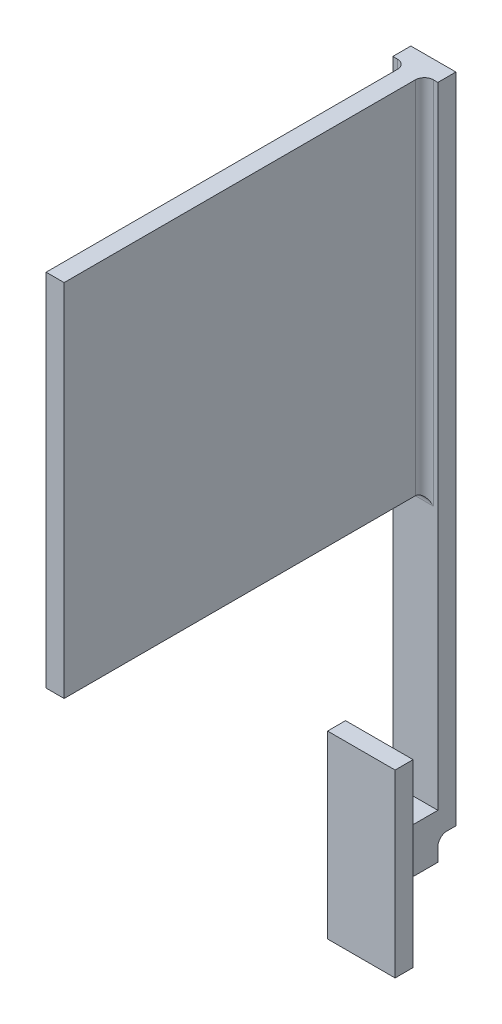
ISO-10303-21;
HEADER;
FILE_DESCRIPTION(('STEP AP214'),'2;1');
FILE_NAME('part.step','',(''),(''),'','','');
FILE_SCHEMA(('AUTOMOTIVE_DESIGN { 1 0 10303 214 1 1 1 1 }'));
ENDSEC;
DATA;
#1=APPLICATION_CONTEXT('core data for automotive mechanical design processes');
#2=APPLICATION_PROTOCOL_DEFINITION('international standard','automotive_design',2000,#1);
#3=PRODUCT_CONTEXT('',#1,'mechanical');
#4=PRODUCT('Part','Part','',(#3));
#5=PRODUCT_RELATED_PRODUCT_CATEGORY('part','',(#4));
#6=PRODUCT_DEFINITION_FORMATION('','',#4);
#7=PRODUCT_DEFINITION_CONTEXT('part definition',#1,'design');
#8=PRODUCT_DEFINITION('design','',#6,#7);
#9=PRODUCT_DEFINITION_SHAPE('','',#8);
#10=(LENGTH_UNIT() NAMED_UNIT(*) SI_UNIT(.MILLI.,.METRE.));
#11=(NAMED_UNIT(*) PLANE_ANGLE_UNIT() SI_UNIT($,.RADIAN.));
#12=(NAMED_UNIT(*) SI_UNIT($,.STERADIAN.) SOLID_ANGLE_UNIT());
#13=UNCERTAINTY_MEASURE_WITH_UNIT(LENGTH_MEASURE(1.E-05),#10,'distance_accuracy_value','');
#14=(GEOMETRIC_REPRESENTATION_CONTEXT(3) GLOBAL_UNCERTAINTY_ASSIGNED_CONTEXT((#13)) GLOBAL_UNIT_ASSIGNED_CONTEXT((#10,
#11,#12)) REPRESENTATION_CONTEXT('',''));
#15=CARTESIAN_POINT('',(0.,0.,0.));
#16=DIRECTION('',(0.,0.,1.));
#17=DIRECTION('',(1.,0.,0.));
#18=AXIS2_PLACEMENT_3D('',#15,#16,#17);
#19=CARTESIAN_POINT('',(0.,0.,-4.));
#20=DIRECTION('',(0.,0.,1.));
#21=DIRECTION('',(1.,0.,0.));
#22=AXIS2_PLACEMENT_3D('',#19,#20,#21);
#23=PLANE('',#22);
#24=DIRECTION('',(1.,0.,0.));
#25=VECTOR('',#24,1.);
#26=CARTESIAN_POINT('',(0.,31.5,-4.));
#27=LINE('',#26,#25);
#28=CARTESIAN_POINT('',(1.99999999999999,31.5,-4.));
#29=VERTEX_POINT('',#28);
#30=CARTESIAN_POINT('',(-1.99999999999999,31.5,-4.));
#31=VERTEX_POINT('',#30);
#32=EDGE_CURVE('E304',#29,#31,#27,.F.);
#33=ORIENTED_EDGE('',*,*,#32,.T.);
#34=DIRECTION('',(0.,-1.,0.));
#35=VECTOR('',#34,1.);
#36=CARTESIAN_POINT('',(-1.99999999999999,0.,-4.));
#37=LINE('',#36,#35);
#38=CARTESIAN_POINT('',(-2.,72.5,-4.));
#39=VERTEX_POINT('',#38);
#40=EDGE_CURVE('E307',#31,#39,#37,.F.);
#41=ORIENTED_EDGE('',*,*,#40,.T.);
#42=DIRECTION('',(1.,0.,0.));
#43=VECTOR('',#42,1.);
#44=CARTESIAN_POINT('',(2.50000000000003,72.5,-4.));
#45=LINE('',#44,#43);
#46=CARTESIAN_POINT('',(-2.5,72.5,-4.));
#47=VERTEX_POINT('',#46);
#48=EDGE_CURVE('E209',#47,#39,#45,.T.);
#49=ORIENTED_EDGE('',*,*,#48,.F.);
#50=DIRECTION('',(0.,1.,0.));
#51=VECTOR('',#50,1.);
#52=CARTESIAN_POINT('',(-2.5,0.,-4.));
#53=LINE('',#52,#51);
#54=CARTESIAN_POINT('',(-2.5,2.5,-4.));
#55=VERTEX_POINT('',#54);
#56=EDGE_CURVE('E198',#55,#47,#53,.T.);
#57=ORIENTED_EDGE('',*,*,#56,.F.);
#58=DIRECTION('',(1.,0.,0.));
#59=VECTOR('',#58,1.);
#60=CARTESIAN_POINT('',(-2.5,2.5,-4.));
#61=LINE('',#60,#59);
#62=CARTESIAN_POINT('',(2.5,2.5,-4.));
#63=VERTEX_POINT('',#62);
#64=EDGE_CURVE('E239',#55,#63,#61,.T.);
#65=ORIENTED_EDGE('',*,*,#64,.T.);
#66=DIRECTION('',(0.,-1.,0.));
#67=VECTOR('',#66,1.);
#68=CARTESIAN_POINT('',(2.5,0.,-4.));
#69=LINE('',#68,#67);
#70=CARTESIAN_POINT('',(2.50000000000003,72.5,-4.));
#71=VERTEX_POINT('',#70);
#72=EDGE_CURVE('E196',#71,#63,#69,.T.);
#73=ORIENTED_EDGE('',*,*,#72,.F.);
#74=CARTESIAN_POINT('',(2.,72.5,-4.));
#75=VERTEX_POINT('',#74);
#76=EDGE_CURVE('E217',#75,#71,#45,.T.);
#77=ORIENTED_EDGE('',*,*,#76,.F.);
#78=DIRECTION('',(0.,1.,0.));
#79=VECTOR('',#78,1.);
#80=CARTESIAN_POINT('',(1.99999999999999,0.,-4.));
#81=LINE('',#80,#79);
#82=EDGE_CURVE('E310',#75,#29,#81,.F.);
#83=ORIENTED_EDGE('',*,*,#82,.T.);
#84=EDGE_LOOP('',(#33,#41,#49,#57,#65,#73,#77,#83));
#85=FACE_BOUND('',#84,.T.);
#86=ADVANCED_FACE('F41',(#85),#23,.T.);
#87=CARTESIAN_POINT('',(3.75,-10.,2.));
#88=DIRECTION('',(-1.,0.,0.));
#89=DIRECTION('',(0.,0.,1.));
#90=AXIS2_PLACEMENT_3D('',#87,#88,#89);
#91=PLANE('',#90);
#92=DIRECTION('',(0.,1.,0.));
#93=VECTOR('',#92,1.);
#94=CARTESIAN_POINT('',(3.75,-10.,0.));
#95=LINE('',#94,#93);
#96=CARTESIAN_POINT('',(3.75,-10.,0.));
#97=VERTEX_POINT('',#96);
#98=CARTESIAN_POINT('',(3.75,10.,0.));
#99=VERTEX_POINT('',#98);
#100=EDGE_CURVE('E265',#97,#99,#95,.T.);
#101=ORIENTED_EDGE('',*,*,#100,.T.);
#102=DIRECTION('',(0.,0.,-1.));
#103=VECTOR('',#102,1.);
#104=CARTESIAN_POINT('',(3.75,10.,2.));
#105=LINE('',#104,#103);
#106=CARTESIAN_POINT('',(3.75,10.,2.));
#107=VERTEX_POINT('',#106);
#108=EDGE_CURVE('E292',#107,#99,#105,.T.);
#109=ORIENTED_EDGE('',*,*,#108,.F.);
#110=DIRECTION('',(0.,1.,0.));
#111=VECTOR('',#110,1.);
#112=CARTESIAN_POINT('',(3.75,-10.,2.));
#113=LINE('',#112,#111);
#114=CARTESIAN_POINT('',(3.75,-10.,2.));
#115=VERTEX_POINT('',#114);
#116=EDGE_CURVE('E268',#115,#107,#113,.T.);
#117=ORIENTED_EDGE('',*,*,#116,.F.);
#118=DIRECTION('',(0.,0.,-1.));
#119=VECTOR('',#118,1.);
#120=CARTESIAN_POINT('',(3.75,-10.,2.));
#121=LINE('',#120,#119);
#122=EDGE_CURVE('E277',#115,#97,#121,.T.);
#123=ORIENTED_EDGE('',*,*,#122,.T.);
#124=EDGE_LOOP('',(#101,#109,#117,#123));
#125=FACE_BOUND('',#124,.T.);
#126=ADVANCED_FACE('F352',(#125),#91,.F.);
#127=CARTESIAN_POINT('',(-3.75,10.,2.));
#128=DIRECTION('',(0.,-1.,0.));
#129=DIRECTION('',(0.,0.,-1.));
#130=AXIS2_PLACEMENT_3D('',#127,#128,#129);
#131=PLANE('',#130);
#132=DIRECTION('',(-1.,0.,0.));
#133=VECTOR('',#132,1.);
#134=CARTESIAN_POINT('',(-3.75,10.,0.));
#135=LINE('',#134,#133);
#136=CARTESIAN_POINT('',(-3.75,10.,0.));
#137=VERTEX_POINT('',#136);
#138=EDGE_CURVE('E276',#99,#137,#135,.T.);
#139=ORIENTED_EDGE('',*,*,#138,.T.);
#140=DIRECTION('',(0.,0.,-1.));
#141=VECTOR('',#140,1.);
#142=CARTESIAN_POINT('',(-3.75,10.,2.));
#143=LINE('',#142,#141);
#144=CARTESIAN_POINT('',(-3.75,10.,2.));
#145=VERTEX_POINT('',#144);
#146=EDGE_CURVE('E289',#145,#137,#143,.T.);
#147=ORIENTED_EDGE('',*,*,#146,.F.);
#148=DIRECTION('',(-1.,0.,0.));
#149=VECTOR('',#148,1.);
#150=CARTESIAN_POINT('',(-3.75,10.,2.));
#151=LINE('',#150,#149);
#152=EDGE_CURVE('E269',#107,#145,#151,.T.);
#153=ORIENTED_EDGE('',*,*,#152,.F.);
#154=ORIENTED_EDGE('',*,*,#108,.T.);
#155=EDGE_LOOP('',(#139,#147,#153,#154));
#156=FACE_BOUND('',#155,.T.);
#157=ADVANCED_FACE('F365',(#156),#131,.F.);
#158=CARTESIAN_POINT('',(-3.75,-10.,2.));
#159=DIRECTION('',(1.,0.,0.));
#160=DIRECTION('',(0.,0.,-1.));
#161=AXIS2_PLACEMENT_3D('',#158,#159,#160);
#162=PLANE('',#161);
#163=DIRECTION('',(0.,-1.,0.));
#164=VECTOR('',#163,1.);
#165=CARTESIAN_POINT('',(-3.75,-10.,0.));
#166=LINE('',#165,#164);
#167=CARTESIAN_POINT('',(-3.75,-10.,0.));
#168=VERTEX_POINT('',#167);
#169=EDGE_CURVE('E281',#137,#168,#166,.T.);
#170=ORIENTED_EDGE('',*,*,#169,.T.);
#171=DIRECTION('',(0.,0.,-1.));
#172=VECTOR('',#171,1.);
#173=CARTESIAN_POINT('',(-3.75,-10.,2.));
#174=LINE('',#173,#172);
#175=CARTESIAN_POINT('',(-3.75,-10.,2.));
#176=VERTEX_POINT('',#175);
#177=EDGE_CURVE('E288',#176,#168,#174,.T.);
#178=ORIENTED_EDGE('',*,*,#177,.F.);
#179=DIRECTION('',(0.,-1.,0.));
#180=VECTOR('',#179,1.);
#181=CARTESIAN_POINT('',(-3.75,-10.,2.));
#182=LINE('',#181,#180);
#183=EDGE_CURVE('E275',#145,#176,#182,.T.);
#184=ORIENTED_EDGE('',*,*,#183,.F.);
#185=ORIENTED_EDGE('',*,*,#146,.T.);
#186=EDGE_LOOP('',(#170,#178,#184,#185));
#187=FACE_BOUND('',#186,.T.);
#188=ADVANCED_FACE('F397',(#187),#162,.F.);
#189=CARTESIAN_POINT('',(-3.75,-10.,2.));
#190=DIRECTION('',(0.,1.,0.));
#191=DIRECTION('',(0.,0.,1.));
#192=AXIS2_PLACEMENT_3D('',#189,#190,#191);
#193=PLANE('',#192);
#194=DIRECTION('',(1.,0.,0.));
#195=VECTOR('',#194,1.);
#196=CARTESIAN_POINT('',(-3.75,-10.,0.));
#197=LINE('',#196,#195);
#198=EDGE_CURVE('E267',#168,#97,#197,.T.);
#199=ORIENTED_EDGE('',*,*,#198,.T.);
#200=ORIENTED_EDGE('',*,*,#122,.F.);
#201=DIRECTION('',(1.,0.,0.));
#202=VECTOR('',#201,1.);
#203=CARTESIAN_POINT('',(-3.75,-10.,2.));
#204=LINE('',#203,#202);
#205=EDGE_CURVE('E274',#176,#115,#204,.T.);
#206=ORIENTED_EDGE('',*,*,#205,.F.);
#207=ORIENTED_EDGE('',*,*,#177,.T.);
#208=EDGE_LOOP('',(#199,#200,#206,#207));
#209=FACE_BOUND('',#208,.T.);
#210=ADVANCED_FACE('F394',(#209),#193,.F.);
#211=CARTESIAN_POINT('',(0.,0.,2.));
#212=DIRECTION('',(0.,0.,-1.));
#213=DIRECTION('',(-1.,0.,0.));
#214=AXIS2_PLACEMENT_3D('',#211,#212,#213);
#215=PLANE('',#214);
#216=ORIENTED_EDGE('',*,*,#116,.T.);
#217=ORIENTED_EDGE('',*,*,#152,.T.);
#218=ORIENTED_EDGE('',*,*,#183,.T.);
#219=ORIENTED_EDGE('',*,*,#205,.T.);
#220=EDGE_LOOP('',(#216,#217,#218,#219));
#221=FACE_BOUND('',#220,.T.);
#222=ADVANCED_FACE('F388',(#221),#215,.F.);
#223=CARTESIAN_POINT('',(0.,0.,0.));
#224=DIRECTION('',(0.,0.,-1.));
#225=DIRECTION('',(-1.,0.,0.));
#226=AXIS2_PLACEMENT_3D('',#223,#224,#225);
#227=PLANE('',#226);
#228=DIRECTION('',(0.,-1.,0.));
#229=VECTOR('',#228,1.);
#230=CARTESIAN_POINT('',(2.5,-2.5,0.));
#231=LINE('',#230,#229);
#232=CARTESIAN_POINT('',(2.5,2.5,0.));
#233=VERTEX_POINT('',#232);
#234=CARTESIAN_POINT('',(2.5,-2.5,0.));
#235=VERTEX_POINT('',#234);
#236=EDGE_CURVE('E233',#233,#235,#231,.T.);
#237=ORIENTED_EDGE('',*,*,#236,.F.);
#238=DIRECTION('',(1.,0.,0.));
#239=VECTOR('',#238,1.);
#240=CARTESIAN_POINT('',(-2.5,2.5,0.));
#241=LINE('',#240,#239);
#242=CARTESIAN_POINT('',(-2.5,2.5,0.));
#243=VERTEX_POINT('',#242);
#244=EDGE_CURVE('E232',#243,#233,#241,.T.);
#245=ORIENTED_EDGE('',*,*,#244,.F.);
#246=DIRECTION('',(0.,1.,0.));
#247=VECTOR('',#246,1.);
#248=CARTESIAN_POINT('',(-2.5,-2.5,0.));
#249=LINE('',#248,#247);
#250=CARTESIAN_POINT('',(-2.5,-2.5,0.));
#251=VERTEX_POINT('',#250);
#252=EDGE_CURVE('E248',#251,#243,#249,.T.);
#253=ORIENTED_EDGE('',*,*,#252,.F.);
#254=DIRECTION('',(-1.,0.,0.));
#255=VECTOR('',#254,1.);
#256=CARTESIAN_POINT('',(-2.5,-2.5,0.));
#257=LINE('',#256,#255);
#258=EDGE_CURVE('E246',#235,#251,#257,.T.);
#259=ORIENTED_EDGE('',*,*,#258,.F.);
#260=EDGE_LOOP('',(#237,#245,#253,#259));
#261=FACE_BOUND('',#260,.T.);
#262=ORIENTED_EDGE('',*,*,#100,.F.);
#263=ORIENTED_EDGE('',*,*,#198,.F.);
#264=ORIENTED_EDGE('',*,*,#169,.F.);
#265=ORIENTED_EDGE('',*,*,#138,.F.);
#266=EDGE_LOOP('',(#262,#263,#264,#265));
#267=FACE_BOUND('',#266,.T.);
#268=ADVANCED_FACE('F386',(#261,#267),#227,.T.);
#269=CARTESIAN_POINT('',(2.5,-2.5,-4.));
#270=DIRECTION('',(-1.,0.,0.));
#271=DIRECTION('',(0.,0.,1.));
#272=AXIS2_PLACEMENT_3D('',#269,#270,#271);
#273=PLANE('',#272);
#274=ORIENTED_EDGE('',*,*,#236,.T.);
#275=DIRECTION('',(0.,0.,1.));
#276=VECTOR('',#275,1.);
#277=CARTESIAN_POINT('',(2.5,-2.5,-4.));
#278=LINE('',#277,#276);
#279=CARTESIAN_POINT('',(2.5,-2.5,-4.));
#280=VERTEX_POINT('',#279);
#281=EDGE_CURVE('E262',#280,#235,#278,.T.);
#282=ORIENTED_EDGE('',*,*,#281,.F.);
#283=DIRECTION('',(0.,-1.,0.));
#284=VECTOR('',#283,1.);
#285=CARTESIAN_POINT('',(2.5,-2.5,-4.));
#286=LINE('',#285,#284);
#287=CARTESIAN_POINT('',(2.5,-1.,-4.));
#288=VERTEX_POINT('',#287);
#289=EDGE_CURVE('E235',#288,#280,#286,.T.);
#290=ORIENTED_EDGE('',*,*,#289,.F.);
#291=CARTESIAN_POINT('',(2.5,-1.,-5.));
#292=DIRECTION('',(-1.,0.,0.));
#293=DIRECTION('',(0.,0.,1.));
#294=AXIS2_PLACEMENT_3D('',#291,#292,#293);
#295=CIRCLE('',#294,1.);
#296=CARTESIAN_POINT('',(2.5,0.,-5.));
#297=VERTEX_POINT('',#296);
#298=EDGE_CURVE('E305',#288,#297,#295,.T.);
#299=ORIENTED_EDGE('',*,*,#298,.T.);
#300=DIRECTION('',(0.,0.,1.));
#301=VECTOR('',#300,1.);
#302=CARTESIAN_POINT('',(2.5,0.,-6.));
#303=LINE('',#302,#301);
#304=CARTESIAN_POINT('',(2.5,0.,-6.));
#305=VERTEX_POINT('',#304);
#306=EDGE_CURVE('E226',#305,#297,#303,.T.);
#307=ORIENTED_EDGE('',*,*,#306,.F.);
#308=DIRECTION('',(0.,-1.,0.));
#309=VECTOR('',#308,1.);
#310=CARTESIAN_POINT('',(2.5,0.,-6.));
#311=LINE('',#310,#309);
#312=CARTESIAN_POINT('',(2.50000000000003,72.5,-6.));
#313=VERTEX_POINT('',#312);
#314=EDGE_CURVE('E202',#313,#305,#311,.T.);
#315=ORIENTED_EDGE('',*,*,#314,.F.);
#316=DIRECTION('',(0.,0.,1.));
#317=VECTOR('',#316,1.);
#318=CARTESIAN_POINT('',(2.50000000000003,72.5,-6.));
#319=LINE('',#318,#317);
#320=EDGE_CURVE('E211',#313,#71,#319,.T.);
#321=ORIENTED_EDGE('',*,*,#320,.T.);
#322=ORIENTED_EDGE('',*,*,#72,.T.);
#323=DIRECTION('',(0.,0.,1.));
#324=VECTOR('',#323,1.);
#325=CARTESIAN_POINT('',(2.5,2.5,-4.));
#326=LINE('',#325,#324);
#327=EDGE_CURVE('E243',#63,#233,#326,.T.);
#328=ORIENTED_EDGE('',*,*,#327,.T.);
#329=EDGE_LOOP('',(#274,#282,#290,#299,#307,#315,#321,#322,#328));
#330=FACE_BOUND('',#329,.T.);
#331=ADVANCED_FACE('F334',(#330),#273,.F.);
#332=CARTESIAN_POINT('',(-2.5,-2.5,-4.));
#333=DIRECTION('',(0.,1.,0.));
#334=DIRECTION('',(-1.,0.,0.));
#335=AXIS2_PLACEMENT_3D('',#332,#333,#334);
#336=PLANE('',#335);
#337=ORIENTED_EDGE('',*,*,#258,.T.);
#338=DIRECTION('',(0.,0.,1.));
#339=VECTOR('',#338,1.);
#340=CARTESIAN_POINT('',(-2.5,-2.5,-4.));
#341=LINE('',#340,#339);
#342=CARTESIAN_POINT('',(-2.5,-2.5,-4.));
#343=VERTEX_POINT('',#342);
#344=EDGE_CURVE('E256',#343,#251,#341,.T.);
#345=ORIENTED_EDGE('',*,*,#344,.F.);
#346=DIRECTION('',(-1.,0.,0.));
#347=VECTOR('',#346,1.);
#348=CARTESIAN_POINT('',(-2.5,-2.5,-4.));
#349=LINE('',#348,#347);
#350=EDGE_CURVE('E234',#280,#343,#349,.T.);
#351=ORIENTED_EDGE('',*,*,#350,.F.);
#352=ORIENTED_EDGE('',*,*,#281,.T.);
#353=EDGE_LOOP('',(#337,#345,#351,#352));
#354=FACE_BOUND('',#353,.T.);
#355=ADVANCED_FACE('F384',(#354),#336,.F.);
#356=CARTESIAN_POINT('',(-2.5,-2.5,-4.));
#357=DIRECTION('',(1.,0.,0.));
#358=DIRECTION('',(0.,0.,-1.));
#359=AXIS2_PLACEMENT_3D('',#356,#357,#358);
#360=PLANE('',#359);
#361=ORIENTED_EDGE('',*,*,#252,.T.);
#362=DIRECTION('',(0.,0.,1.));
#363=VECTOR('',#362,1.);
#364=CARTESIAN_POINT('',(-2.5,2.5,-4.));
#365=LINE('',#364,#363);
#366=EDGE_CURVE('E257',#55,#243,#365,.T.);
#367=ORIENTED_EDGE('',*,*,#366,.F.);
#368=ORIENTED_EDGE('',*,*,#56,.T.);
#369=DIRECTION('',(0.,0.,1.));
#370=VECTOR('',#369,1.);
#371=CARTESIAN_POINT('',(-2.5,72.5,-6.));
#372=LINE('',#371,#370);
#373=CARTESIAN_POINT('',(-2.5,72.5,-6.));
#374=VERTEX_POINT('',#373);
#375=EDGE_CURVE('E225',#374,#47,#372,.T.);
#376=ORIENTED_EDGE('',*,*,#375,.F.);
#377=DIRECTION('',(0.,1.,0.));
#378=VECTOR('',#377,1.);
#379=CARTESIAN_POINT('',(-2.5,0.,-6.));
#380=LINE('',#379,#378);
#381=CARTESIAN_POINT('',(-2.5,0.,-6.));
#382=VERTEX_POINT('',#381);
#383=EDGE_CURVE('E212',#382,#374,#380,.T.);
#384=ORIENTED_EDGE('',*,*,#383,.F.);
#385=DIRECTION('',(0.,0.,1.));
#386=VECTOR('',#385,1.);
#387=CARTESIAN_POINT('',(-2.5,0.,-6.));
#388=LINE('',#387,#386);
#389=CARTESIAN_POINT('',(-2.5,0.,-5.));
#390=VERTEX_POINT('',#389);
#391=EDGE_CURVE('E222',#382,#390,#388,.T.);
#392=ORIENTED_EDGE('',*,*,#391,.T.);
#393=CARTESIAN_POINT('',(-2.5,-0.999999999999999,-5.));
#394=DIRECTION('',(1.,0.,0.));
#395=DIRECTION('',(0.,0.,-1.));
#396=AXIS2_PLACEMENT_3D('',#393,#394,#395);
#397=CIRCLE('',#396,1.);
#398=CARTESIAN_POINT('',(-2.5,-0.999999999999999,-4.));
#399=VERTEX_POINT('',#398);
#400=EDGE_CURVE('E297',#390,#399,#397,.T.);
#401=ORIENTED_EDGE('',*,*,#400,.T.);
#402=DIRECTION('',(0.,1.,0.));
#403=VECTOR('',#402,1.);
#404=CARTESIAN_POINT('',(-2.5,-2.5,-4.));
#405=LINE('',#404,#403);
#406=EDGE_CURVE('E240',#343,#399,#405,.T.);
#407=ORIENTED_EDGE('',*,*,#406,.F.);
#408=ORIENTED_EDGE('',*,*,#344,.T.);
#409=EDGE_LOOP('',(#361,#367,#368,#376,#384,#392,#401,#407,#408));
#410=FACE_BOUND('',#409,.T.);
#411=ADVANCED_FACE('F343',(#410),#360,.F.);
#412=CARTESIAN_POINT('',(-2.5,2.5,-4.));
#413=DIRECTION('',(0.,-1.,0.));
#414=DIRECTION('',(1.,0.,0.));
#415=AXIS2_PLACEMENT_3D('',#412,#413,#414);
#416=PLANE('',#415);
#417=ORIENTED_EDGE('',*,*,#244,.T.);
#418=ORIENTED_EDGE('',*,*,#327,.F.);
#419=ORIENTED_EDGE('',*,*,#64,.F.);
#420=ORIENTED_EDGE('',*,*,#366,.T.);
#421=EDGE_LOOP('',(#417,#418,#419,#420));
#422=FACE_BOUND('',#421,.T.);
#423=ADVANCED_FACE('F376',(#422),#416,.F.);
#424=CARTESIAN_POINT('',(0.,0.,-4.));
#425=DIRECTION('',(0.,0.,-1.));
#426=DIRECTION('',(-1.,0.,0.));
#427=AXIS2_PLACEMENT_3D('',#424,#425,#426);
#428=PLANE('',#427);
#429=ORIENTED_EDGE('',*,*,#406,.T.);
#430=DIRECTION('',(-1.,0.,0.));
#431=VECTOR('',#430,1.);
#432=CARTESIAN_POINT('',(0.,-1.,-4.));
#433=LINE('',#432,#431);
#434=EDGE_CURVE('E296',#399,#288,#433,.F.);
#435=ORIENTED_EDGE('',*,*,#434,.T.);
#436=ORIENTED_EDGE('',*,*,#289,.T.);
#437=ORIENTED_EDGE('',*,*,#350,.T.);
#438=EDGE_LOOP('',(#429,#435,#436,#437));
#439=FACE_BOUND('',#438,.T.);
#440=ADVANCED_FACE('F375',(#439),#428,.T.);
#441=CARTESIAN_POINT('',(2.5,0.,-6.));
#442=DIRECTION('',(0.,1.,0.));
#443=DIRECTION('',(-1.,0.,0.));
#444=AXIS2_PLACEMENT_3D('',#441,#442,#443);
#445=PLANE('',#444);
#446=ORIENTED_EDGE('',*,*,#306,.T.);
#447=DIRECTION('',(-1.,0.,0.));
#448=VECTOR('',#447,1.);
#449=CARTESIAN_POINT('',(2.5,0.,-5.));
#450=LINE('',#449,#448);
#451=EDGE_CURVE('E294',#297,#390,#450,.T.);
#452=ORIENTED_EDGE('',*,*,#451,.T.);
#453=ORIENTED_EDGE('',*,*,#391,.F.);
#454=DIRECTION('',(-1.,0.,0.));
#455=VECTOR('',#454,1.);
#456=CARTESIAN_POINT('',(2.5,0.,-6.));
#457=LINE('',#456,#455);
#458=EDGE_CURVE('E206',#305,#382,#457,.T.);
#459=ORIENTED_EDGE('',*,*,#458,.F.);
#460=EDGE_LOOP('',(#446,#452,#453,#459));
#461=FACE_BOUND('',#460,.T.);
#462=ADVANCED_FACE('F367',(#461),#445,.F.);
#463=CARTESIAN_POINT('',(2.50000000000003,72.5,-6.));
#464=DIRECTION('',(0.,-1.,0.));
#465=DIRECTION('',(0.,0.,-1.));
#466=AXIS2_PLACEMENT_3D('',#463,#464,#465);
#467=PLANE('',#466);
#468=ORIENTED_EDGE('',*,*,#48,.T.);
#469=CARTESIAN_POINT('',(-2.,72.5,-3.));
#470=DIRECTION('',(0.,-1.,0.));
#471=DIRECTION('',(0.,0.,-1.));
#472=AXIS2_PLACEMENT_3D('',#469,#470,#471);
#473=CIRCLE('',#472,1.);
#474=CARTESIAN_POINT('',(-1.,72.5,-3.));
#475=VERTEX_POINT('',#474);
#476=EDGE_CURVE('E49',#39,#475,#473,.T.);
#477=ORIENTED_EDGE('',*,*,#476,.T.);
#478=DIRECTION('',(0.,0.,-1.));
#479=VECTOR('',#478,1.);
#480=CARTESIAN_POINT('',(-1.,72.5,36.));
#481=LINE('',#480,#479);
#482=CARTESIAN_POINT('',(-1.,72.5,36.));
#483=VERTEX_POINT('',#482);
#484=EDGE_CURVE('E585',#483,#475,#481,.T.);
#485=ORIENTED_EDGE('',*,*,#484,.F.);
#486=DIRECTION('',(-1.,0.,0.));
#487=VECTOR('',#486,1.);
#488=CARTESIAN_POINT('',(-1.,72.5,36.));
#489=LINE('',#488,#487);
#490=CARTESIAN_POINT('',(1.,72.5,36.));
#491=VERTEX_POINT('',#490);
#492=EDGE_CURVE('E190',#491,#483,#489,.T.);
#493=ORIENTED_EDGE('',*,*,#492,.F.);
#494=DIRECTION('',(0.,0.,-1.));
#495=VECTOR('',#494,1.);
#496=CARTESIAN_POINT('',(1.,72.5,36.));
#497=LINE('',#496,#495);
#498=CARTESIAN_POINT('',(1.,72.5,-3.));
#499=VERTEX_POINT('',#498);
#500=EDGE_CURVE('E203',#491,#499,#497,.T.);
#501=ORIENTED_EDGE('',*,*,#500,.T.);
#502=CARTESIAN_POINT('',(2.,72.5,-3.));
#503=DIRECTION('',(0.,-1.,0.));
#504=DIRECTION('',(0.,0.,-1.));
#505=AXIS2_PLACEMENT_3D('',#502,#503,#504);
#506=CIRCLE('',#505,1.);
#507=EDGE_CURVE('E11',#499,#75,#506,.T.);
#508=ORIENTED_EDGE('',*,*,#507,.T.);
#509=ORIENTED_EDGE('',*,*,#76,.T.);
#510=ORIENTED_EDGE('',*,*,#320,.F.);
#511=DIRECTION('',(1.,0.,0.));
#512=VECTOR('',#511,1.);
#513=CARTESIAN_POINT('',(2.50000000000003,72.5,-6.));
#514=LINE('',#513,#512);
#515=EDGE_CURVE('E214',#374,#313,#514,.T.);
#516=ORIENTED_EDGE('',*,*,#515,.F.);
#517=ORIENTED_EDGE('',*,*,#375,.T.);
#518=EDGE_LOOP('',(#468,#477,#485,#493,#501,#508,#509,#510,#516,#517));
#519=FACE_BOUND('',#518,.T.);
#520=ADVANCED_FACE('F327',(#519),#467,.F.);
#521=CARTESIAN_POINT('',(0.,0.,-6.));
#522=DIRECTION('',(0.,0.,1.));
#523=DIRECTION('',(1.,0.,0.));
#524=AXIS2_PLACEMENT_3D('',#521,#522,#523);
#525=PLANE('',#524);
#526=ORIENTED_EDGE('',*,*,#314,.T.);
#527=ORIENTED_EDGE('',*,*,#458,.T.);
#528=ORIENTED_EDGE('',*,*,#383,.T.);
#529=ORIENTED_EDGE('',*,*,#515,.T.);
#530=EDGE_LOOP('',(#526,#527,#528,#529));
#531=FACE_BOUND('',#530,.T.);
#532=ADVANCED_FACE('F342',(#531),#525,.F.);
#533=CARTESIAN_POINT('',(-1.,72.5,36.));
#534=DIRECTION('',(1.,0.,0.));
#535=DIRECTION('',(0.,1.,0.));
#536=AXIS2_PLACEMENT_3D('',#533,#534,#535);
#537=PLANE('',#536);
#538=ORIENTED_EDGE('',*,*,#484,.T.);
#539=DIRECTION('',(0.,-1.,0.));
#540=VECTOR('',#539,1.);
#541=CARTESIAN_POINT('',(-1.,72.5,-3.));
#542=LINE('',#541,#540);
#543=CARTESIAN_POINT('',(-0.999999999999995,32.5,-3.));
#544=VERTEX_POINT('',#543);
#545=EDGE_CURVE('E193',#475,#544,#542,.T.);
#546=ORIENTED_EDGE('',*,*,#545,.T.);
#547=DIRECTION('',(0.,0.,-1.));
#548=VECTOR('',#547,1.);
#549=CARTESIAN_POINT('',(-0.999999999999995,32.5,36.));
#550=LINE('',#549,#548);
#551=CARTESIAN_POINT('',(-0.999999999999995,32.5,36.));
#552=VERTEX_POINT('',#551);
#553=EDGE_CURVE('E180',#552,#544,#550,.T.);
#554=ORIENTED_EDGE('',*,*,#553,.F.);
#555=DIRECTION('',(0.,-1.,0.));
#556=VECTOR('',#555,1.);
#557=CARTESIAN_POINT('',(-1.,72.5,36.));
#558=LINE('',#557,#556);
#559=EDGE_CURVE('E185',#483,#552,#558,.T.);
#560=ORIENTED_EDGE('',*,*,#559,.F.);
#561=EDGE_LOOP('',(#538,#546,#554,#560));
#562=FACE_BOUND('',#561,.T.);
#563=ADVANCED_FACE('F194',(#562),#537,.F.);
#564=CARTESIAN_POINT('',(-0.999999999999995,32.5,36.));
#565=DIRECTION('',(0.,1.,0.));
#566=DIRECTION('',(0.,0.,1.));
#567=AXIS2_PLACEMENT_3D('',#564,#565,#566);
#568=PLANE('',#567);
#569=ORIENTED_EDGE('',*,*,#553,.T.);
#570=DIRECTION('',(1.,0.,0.));
#571=VECTOR('',#570,1.);
#572=CARTESIAN_POINT('',(-0.999999999999995,32.5,-3.));
#573=LINE('',#572,#571);
#574=CARTESIAN_POINT('',(0.999999999999995,32.5,-3.));
#575=VERTEX_POINT('',#574);
#576=EDGE_CURVE('E59',#544,#575,#573,.T.);
#577=ORIENTED_EDGE('',*,*,#576,.T.);
#578=DIRECTION('',(0.,0.,-1.));
#579=VECTOR('',#578,1.);
#580=CARTESIAN_POINT('',(0.999999999999995,32.5,36.));
#581=LINE('',#580,#579);
#582=CARTESIAN_POINT('',(0.999999999999995,32.5,36.));
#583=VERTEX_POINT('',#582);
#584=EDGE_CURVE('E178',#583,#575,#581,.T.);
#585=ORIENTED_EDGE('',*,*,#584,.F.);
#586=DIRECTION('',(1.,0.,0.));
#587=VECTOR('',#586,1.);
#588=CARTESIAN_POINT('',(-0.999999999999995,32.5,36.));
#589=LINE('',#588,#587);
#590=EDGE_CURVE('E173',#552,#583,#589,.T.);
#591=ORIENTED_EDGE('',*,*,#590,.F.);
#592=EDGE_LOOP('',(#569,#577,#585,#591));
#593=FACE_BOUND('',#592,.T.);
#594=ADVANCED_FACE('F174',(#593),#568,.F.);
#595=CARTESIAN_POINT('',(1.,72.5,36.));
#596=DIRECTION('',(-1.,0.,0.));
#597=DIRECTION('',(0.,-1.,0.));
#598=AXIS2_PLACEMENT_3D('',#595,#596,#597);
#599=PLANE('',#598);
#600=ORIENTED_EDGE('',*,*,#584,.T.);
#601=DIRECTION('',(0.,1.,0.));
#602=VECTOR('',#601,1.);
#603=CARTESIAN_POINT('',(1.,72.5,-3.));
#604=LINE('',#603,#602);
#605=EDGE_CURVE('E63',#575,#499,#604,.T.);
#606=ORIENTED_EDGE('',*,*,#605,.T.);
#607=ORIENTED_EDGE('',*,*,#500,.F.);
#608=DIRECTION('',(0.,1.,0.));
#609=VECTOR('',#608,1.);
#610=CARTESIAN_POINT('',(1.,72.5,36.));
#611=LINE('',#610,#609);
#612=EDGE_CURVE('E181',#583,#491,#611,.T.);
#613=ORIENTED_EDGE('',*,*,#612,.F.);
#614=EDGE_LOOP('',(#600,#606,#607,#613));
#615=FACE_BOUND('',#614,.T.);
#616=ADVANCED_FACE('F414',(#615),#599,.F.);
#617=CARTESIAN_POINT('',(0.,0.,36.));
#618=DIRECTION('',(0.,0.,1.));
#619=DIRECTION('',(1.,0.,0.));
#620=AXIS2_PLACEMENT_3D('',#617,#618,#619);
#621=PLANE('',#620);
#622=ORIENTED_EDGE('',*,*,#559,.T.);
#623=ORIENTED_EDGE('',*,*,#590,.T.);
#624=ORIENTED_EDGE('',*,*,#612,.T.);
#625=ORIENTED_EDGE('',*,*,#492,.T.);
#626=EDGE_LOOP('',(#622,#623,#624,#625));
#627=FACE_BOUND('',#626,.T.);
#628=ADVANCED_FACE('F184',(#627),#621,.T.);
#629=CARTESIAN_POINT('',(2.5,-1.,-5.));
#630=DIRECTION('',(-1.,0.,0.));
#631=DIRECTION('',(0.,-1.,0.));
#632=AXIS2_PLACEMENT_3D('',#629,#630,#631);
#633=CYLINDRICAL_SURFACE('',#632,1.);
#634=ORIENTED_EDGE('',*,*,#298,.F.);
#635=ORIENTED_EDGE('',*,*,#434,.F.);
#636=ORIENTED_EDGE('',*,*,#400,.F.);
#637=ORIENTED_EDGE('',*,*,#451,.F.);
#638=EDGE_LOOP('',(#634,#635,#636,#637));
#639=FACE_BOUND('',#638,.T.);
#640=ADVANCED_FACE('F410',(#639),#633,.F.);
#641=CARTESIAN_POINT('',(2.,72.5,-3.));
#642=DIRECTION('',(0.,1.,0.));
#643=DIRECTION('',(-1.,0.,0.));
#644=AXIS2_PLACEMENT_3D('',#641,#642,#643);
#645=CYLINDRICAL_SURFACE('',#644,1.);
#646=ORIENTED_EDGE('',*,*,#507,.F.);
#647=ORIENTED_EDGE('',*,*,#605,.F.);
#648=CARTESIAN_POINT('',(1.99999999999999,31.5,-3.));
#649=DIRECTION('',(0.707106781186548,0.707106781186547,0.));
#650=DIRECTION('',(0.707106781186547,-0.707106781186548,0.));
#651=AXIS2_PLACEMENT_3D('',#648,#649,#650);
#652=ELLIPSE('',#651,1.41421356237309,1.);
#653=EDGE_CURVE('E44',#29,#575,#652,.T.);
#654=ORIENTED_EDGE('',*,*,#653,.F.);
#655=ORIENTED_EDGE('',*,*,#82,.F.);
#656=EDGE_LOOP('',(#646,#647,#654,#655));
#657=FACE_BOUND('',#656,.T.);
#658=ADVANCED_FACE('F43',(#657),#645,.F.);
#659=CARTESIAN_POINT('',(-0.999999999999995,31.5,-3.));
#660=DIRECTION('',(1.,0.,0.));
#661=DIRECTION('',(0.,0.,-1.));
#662=AXIS2_PLACEMENT_3D('',#659,#660,#661);
#663=CYLINDRICAL_SURFACE('',#662,1.);
#664=ORIENTED_EDGE('',*,*,#653,.T.);
#665=ORIENTED_EDGE('',*,*,#576,.F.);
#666=CARTESIAN_POINT('',(-1.99999999999999,31.5,-3.));
#667=DIRECTION('',(0.707106781186548,-0.707106781186547,0.));
#668=DIRECTION('',(0.707106781186547,0.707106781186548,0.));
#669=AXIS2_PLACEMENT_3D('',#666,#667,#668);
#670=ELLIPSE('',#669,1.41421356237309,1.);
#671=EDGE_CURVE('E312',#31,#544,#670,.T.);
#672=ORIENTED_EDGE('',*,*,#671,.F.);
#673=ORIENTED_EDGE('',*,*,#32,.F.);
#674=EDGE_LOOP('',(#664,#665,#672,#673));
#675=FACE_BOUND('',#674,.T.);
#676=ADVANCED_FACE('F322',(#675),#663,.F.);
#677=CARTESIAN_POINT('',(-2.,72.5,-3.));
#678=DIRECTION('',(0.,-1.,0.));
#679=DIRECTION('',(1.,0.,0.));
#680=AXIS2_PLACEMENT_3D('',#677,#678,#679);
#681=CYLINDRICAL_SURFACE('',#680,1.);
#682=ORIENTED_EDGE('',*,*,#476,.F.);
#683=ORIENTED_EDGE('',*,*,#40,.F.);
#684=ORIENTED_EDGE('',*,*,#671,.T.);
#685=ORIENTED_EDGE('',*,*,#545,.F.);
#686=EDGE_LOOP('',(#682,#683,#684,#685));
#687=FACE_BOUND('',#686,.T.);
#688=ADVANCED_FACE('F347',(#687),#681,.F.);
#689=CLOSED_SHELL('',(#86,#126,#157,#188,#210,#222,#268,#331,#355,#411,#423,#440,#462,#520,#532,
#563,#594,#616,#628,#640,#658,#676,#688));
#690=MANIFOLD_SOLID_BREP('B2',#689);
#691=ADVANCED_BREP_SHAPE_REPRESENTATION('',(#18,#690),#14);
#692=SHAPE_DEFINITION_REPRESENTATION(#9,#691);
ENDSEC;
END-ISO-10303-21;
